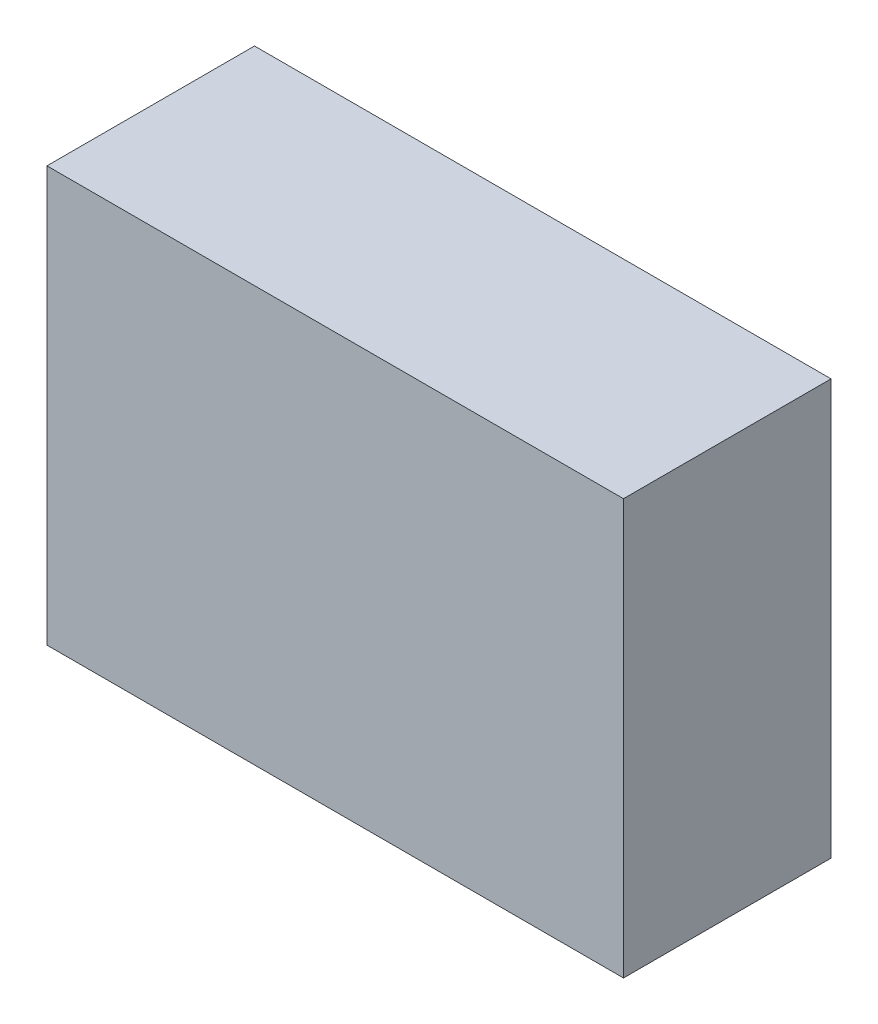
ISO-10303-21;
HEADER;
FILE_DESCRIPTION(('STEP AP214'),'2;1');
FILE_NAME('part.step','',(''),(''),'','','');
FILE_SCHEMA(('AUTOMOTIVE_DESIGN { 1 0 10303 214 1 1 1 1 }'));
ENDSEC;
DATA;
#1=APPLICATION_CONTEXT('core data for automotive mechanical design processes');
#2=APPLICATION_PROTOCOL_DEFINITION('international standard','automotive_design',2000,#1);
#3=PRODUCT_CONTEXT('',#1,'mechanical');
#4=PRODUCT('Part','Part','',(#3));
#5=PRODUCT_RELATED_PRODUCT_CATEGORY('part','',(#4));
#6=PRODUCT_DEFINITION_FORMATION('','',#4);
#7=PRODUCT_DEFINITION_CONTEXT('part definition',#1,'design');
#8=PRODUCT_DEFINITION('design','',#6,#7);
#9=PRODUCT_DEFINITION_SHAPE('','',#8);
#10=(LENGTH_UNIT() NAMED_UNIT(*) SI_UNIT(.MILLI.,.METRE.));
#11=(NAMED_UNIT(*) PLANE_ANGLE_UNIT() SI_UNIT($,.RADIAN.));
#12=(NAMED_UNIT(*) SI_UNIT($,.STERADIAN.) SOLID_ANGLE_UNIT());
#13=UNCERTAINTY_MEASURE_WITH_UNIT(LENGTH_MEASURE(1.E-05),#10,'distance_accuracy_value','');
#14=(GEOMETRIC_REPRESENTATION_CONTEXT(3) GLOBAL_UNCERTAINTY_ASSIGNED_CONTEXT((#13)) GLOBAL_UNIT_ASSIGNED_CONTEXT((#10,
#11,#12)) REPRESENTATION_CONTEXT('',''));
#15=CARTESIAN_POINT('',(0.,0.,0.));
#16=DIRECTION('',(0.,0.,1.));
#17=DIRECTION('',(1.,0.,0.));
#18=AXIS2_PLACEMENT_3D('',#15,#16,#17);
#19=CARTESIAN_POINT('',(0.,0.,4.5));
#20=DIRECTION('',(0.,0.,1.));
#21=DIRECTION('',(1.,0.,0.));
#22=AXIS2_PLACEMENT_3D('',#19,#20,#21);
#23=PLANE('',#22);
#24=DIRECTION('',(-1.,0.,0.));
#25=VECTOR('',#24,1.);
#26=CARTESIAN_POINT('',(0.,-9.,4.5));
#27=LINE('',#26,#25);
#28=CARTESIAN_POINT('',(12.5,-9.,4.5));
#29=VERTEX_POINT('',#28);
#30=CARTESIAN_POINT('',(-12.5,-9.,4.5));
#31=VERTEX_POINT('',#30);
#32=EDGE_CURVE('E10',#29,#31,#27,.T.);
#33=ORIENTED_EDGE('',*,*,#32,.F.);
#34=DIRECTION('',(0.,-1.,0.));
#35=VECTOR('',#34,1.);
#36=CARTESIAN_POINT('',(12.5,0.,4.5));
#37=LINE('',#36,#35);
#38=CARTESIAN_POINT('',(12.5,9.,4.5));
#39=VERTEX_POINT('',#38);
#40=EDGE_CURVE('E58',#39,#29,#37,.T.);
#41=ORIENTED_EDGE('',*,*,#40,.F.);
#42=DIRECTION('',(1.,0.,0.));
#43=VECTOR('',#42,1.);
#44=CARTESIAN_POINT('',(0.,9.,4.5));
#45=LINE('',#44,#43);
#46=CARTESIAN_POINT('',(-12.5,9.,4.5));
#47=VERTEX_POINT('',#46);
#48=EDGE_CURVE('E88',#47,#39,#45,.T.);
#49=ORIENTED_EDGE('',*,*,#48,.F.);
#50=DIRECTION('',(0.,1.,0.));
#51=VECTOR('',#50,1.);
#52=CARTESIAN_POINT('',(-12.5,0.,4.5));
#53=LINE('',#52,#51);
#54=EDGE_CURVE('E23',#31,#47,#53,.T.);
#55=ORIENTED_EDGE('',*,*,#54,.F.);
#56=EDGE_LOOP('',(#33,#41,#49,#55));
#57=FACE_BOUND('',#56,.T.);
#58=ADVANCED_FACE('F16',(#57),#23,.T.);
#59=CARTESIAN_POINT('',(0.,-9.,-4.5));
#60=DIRECTION('',(0.,-1.,0.));
#61=DIRECTION('',(0.,0.,-1.));
#62=AXIS2_PLACEMENT_3D('',#59,#60,#61);
#63=PLANE('',#62);
#64=DIRECTION('',(0.,0.,1.));
#65=VECTOR('',#64,1.);
#66=CARTESIAN_POINT('',(12.5,-9.,-4.5));
#67=LINE('',#66,#65);
#68=CARTESIAN_POINT('',(12.5,-9.,-4.5));
#69=VERTEX_POINT('',#68);
#70=EDGE_CURVE('E52',#69,#29,#67,.T.);
#71=ORIENTED_EDGE('',*,*,#70,.T.);
#72=ORIENTED_EDGE('',*,*,#32,.T.);
#73=DIRECTION('',(0.,0.,1.));
#74=VECTOR('',#73,1.);
#75=CARTESIAN_POINT('',(-12.5,-9.,-4.5));
#76=LINE('',#75,#74);
#77=CARTESIAN_POINT('',(-12.5,-9.,-4.5));
#78=VERTEX_POINT('',#77);
#79=EDGE_CURVE('E66',#78,#31,#76,.T.);
#80=ORIENTED_EDGE('',*,*,#79,.F.);
#81=DIRECTION('',(1.,0.,0.));
#82=VECTOR('',#81,1.);
#83=CARTESIAN_POINT('',(0.,-9.,-4.5));
#84=LINE('',#83,#82);
#85=EDGE_CURVE('E63',#78,#69,#84,.T.);
#86=ORIENTED_EDGE('',*,*,#85,.T.);
#87=EDGE_LOOP('',(#71,#72,#80,#86));
#88=FACE_BOUND('',#87,.T.);
#89=ADVANCED_FACE('F65',(#88),#63,.T.);
#90=CARTESIAN_POINT('',(-12.5,0.,-4.5));
#91=DIRECTION('',(-1.,0.,0.));
#92=DIRECTION('',(0.,0.,1.));
#93=AXIS2_PLACEMENT_3D('',#90,#91,#92);
#94=PLANE('',#93);
#95=ORIENTED_EDGE('',*,*,#79,.T.);
#96=ORIENTED_EDGE('',*,*,#54,.T.);
#97=DIRECTION('',(0.,0.,1.));
#98=VECTOR('',#97,1.);
#99=CARTESIAN_POINT('',(-12.5,9.,-4.5));
#100=LINE('',#99,#98);
#101=CARTESIAN_POINT('',(-12.5,9.,-4.5));
#102=VERTEX_POINT('',#101);
#103=EDGE_CURVE('E81',#102,#47,#100,.T.);
#104=ORIENTED_EDGE('',*,*,#103,.F.);
#105=DIRECTION('',(0.,-1.,0.));
#106=VECTOR('',#105,1.);
#107=CARTESIAN_POINT('',(-12.5,0.,-4.5));
#108=LINE('',#107,#106);
#109=EDGE_CURVE('E69',#102,#78,#108,.T.);
#110=ORIENTED_EDGE('',*,*,#109,.T.);
#111=EDGE_LOOP('',(#95,#96,#104,#110));
#112=FACE_BOUND('',#111,.T.);
#113=ADVANCED_FACE('F89',(#112),#94,.T.);
#114=CARTESIAN_POINT('',(0.,9.,-4.5));
#115=DIRECTION('',(0.,1.,0.));
#116=DIRECTION('',(0.,0.,1.));
#117=AXIS2_PLACEMENT_3D('',#114,#115,#116);
#118=PLANE('',#117);
#119=ORIENTED_EDGE('',*,*,#103,.T.);
#120=ORIENTED_EDGE('',*,*,#48,.T.);
#121=DIRECTION('',(0.,0.,1.));
#122=VECTOR('',#121,1.);
#123=CARTESIAN_POINT('',(12.5,9.,-4.5));
#124=LINE('',#123,#122);
#125=CARTESIAN_POINT('',(12.5,9.,-4.5));
#126=VERTEX_POINT('',#125);
#127=EDGE_CURVE('E61',#126,#39,#124,.T.);
#128=ORIENTED_EDGE('',*,*,#127,.F.);
#129=DIRECTION('',(-1.,0.,0.));
#130=VECTOR('',#129,1.);
#131=CARTESIAN_POINT('',(0.,9.,-4.5));
#132=LINE('',#131,#130);
#133=EDGE_CURVE('E74',#126,#102,#132,.T.);
#134=ORIENTED_EDGE('',*,*,#133,.T.);
#135=EDGE_LOOP('',(#119,#120,#128,#134));
#136=FACE_BOUND('',#135,.T.);
#137=ADVANCED_FACE('F86',(#136),#118,.T.);
#138=CARTESIAN_POINT('',(0.,0.,-4.5));
#139=DIRECTION('',(0.,0.,-1.));
#140=DIRECTION('',(-1.,0.,0.));
#141=AXIS2_PLACEMENT_3D('',#138,#139,#140);
#142=PLANE('',#141);
#143=DIRECTION('',(0.,1.,0.));
#144=VECTOR('',#143,1.);
#145=CARTESIAN_POINT('',(12.5,0.,-4.5));
#146=LINE('',#145,#144);
#147=EDGE_CURVE('E59',#69,#126,#146,.T.);
#148=ORIENTED_EDGE('',*,*,#147,.F.);
#149=ORIENTED_EDGE('',*,*,#85,.F.);
#150=ORIENTED_EDGE('',*,*,#109,.F.);
#151=ORIENTED_EDGE('',*,*,#133,.F.);
#152=EDGE_LOOP('',(#148,#149,#150,#151));
#153=FACE_BOUND('',#152,.T.);
#154=ADVANCED_FACE('F73',(#153),#142,.T.);
#155=CARTESIAN_POINT('',(12.5,0.,-4.5));
#156=DIRECTION('',(1.,0.,0.));
#157=DIRECTION('',(0.,0.,-1.));
#158=AXIS2_PLACEMENT_3D('',#155,#156,#157);
#159=PLANE('',#158);
#160=ORIENTED_EDGE('',*,*,#147,.T.);
#161=ORIENTED_EDGE('',*,*,#127,.T.);
#162=ORIENTED_EDGE('',*,*,#40,.T.);
#163=ORIENTED_EDGE('',*,*,#70,.F.);
#164=EDGE_LOOP('',(#160,#161,#162,#163));
#165=FACE_BOUND('',#164,.T.);
#166=ADVANCED_FACE('F54',(#165),#159,.T.);
#167=CLOSED_SHELL('',(#58,#89,#113,#137,#154,#166));
#168=MANIFOLD_SOLID_BREP('B1',#167);
#169=ADVANCED_BREP_SHAPE_REPRESENTATION('',(#18,#168),#14);
#170=SHAPE_DEFINITION_REPRESENTATION(#9,#169);
ENDSEC;
END-ISO-10303-21;
